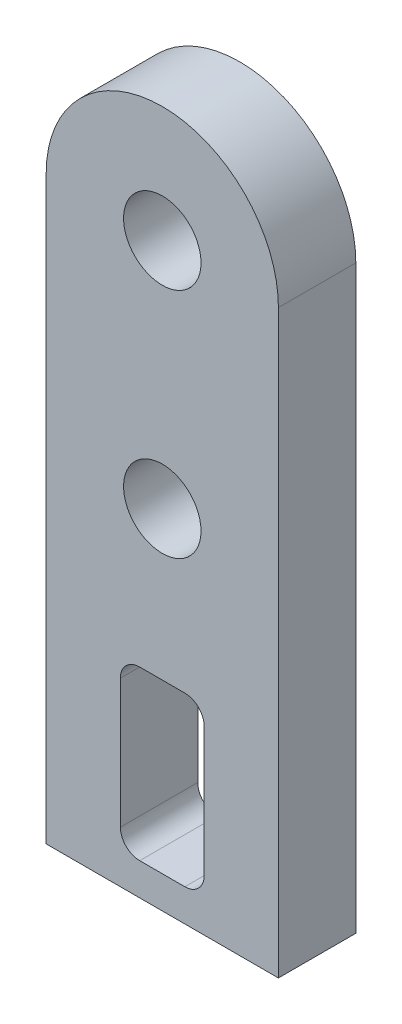
ISO-10303-21;
HEADER;
FILE_DESCRIPTION(('STEP AP214'),'2;1');
FILE_NAME('part.step','',(''),(''),'','','');
FILE_SCHEMA(('AUTOMOTIVE_DESIGN { 1 0 10303 214 1 1 1 1 }'));
ENDSEC;
DATA;
#1=APPLICATION_CONTEXT('core data for automotive mechanical design processes');
#2=APPLICATION_PROTOCOL_DEFINITION('international standard','automotive_design',2000,#1);
#3=PRODUCT_CONTEXT('',#1,'mechanical');
#4=PRODUCT('Part','Part','',(#3));
#5=PRODUCT_RELATED_PRODUCT_CATEGORY('part','',(#4));
#6=PRODUCT_DEFINITION_FORMATION('','',#4);
#7=PRODUCT_DEFINITION_CONTEXT('part definition',#1,'design');
#8=PRODUCT_DEFINITION('design','',#6,#7);
#9=PRODUCT_DEFINITION_SHAPE('','',#8);
#10=(LENGTH_UNIT() NAMED_UNIT(*) SI_UNIT(.MILLI.,.METRE.));
#11=(NAMED_UNIT(*) PLANE_ANGLE_UNIT() SI_UNIT($,.RADIAN.));
#12=(NAMED_UNIT(*) SI_UNIT($,.STERADIAN.) SOLID_ANGLE_UNIT());
#13=UNCERTAINTY_MEASURE_WITH_UNIT(LENGTH_MEASURE(1.E-05),#10,'distance_accuracy_value','');
#14=(GEOMETRIC_REPRESENTATION_CONTEXT(3) GLOBAL_UNCERTAINTY_ASSIGNED_CONTEXT((#13)) GLOBAL_UNIT_ASSIGNED_CONTEXT((#10,
#11,#12)) REPRESENTATION_CONTEXT('',''));
#15=CARTESIAN_POINT('',(0.,0.,0.));
#16=DIRECTION('',(0.,0.,1.));
#17=DIRECTION('',(1.,0.,0.));
#18=AXIS2_PLACEMENT_3D('',#15,#16,#17);
#19=CARTESIAN_POINT('',(207.4731699104,182.5565570417,3.));
#20=DIRECTION('',(0.,0.,1.));
#21=DIRECTION('',(1.,0.,0.));
#22=AXIS2_PLACEMENT_3D('',#19,#20,#21);
#23=PLANE('',#22);
#24=CARTESIAN_POINT('',(207.4731699104,182.5565570417,3.));
#25=DIRECTION('',(0.,0.,1.));
#26=DIRECTION('',(1.,0.,0.));
#27=AXIS2_PLACEMENT_3D('',#24,#25,#26);
#28=CIRCLE('',#27,1.5);
#29=CARTESIAN_POINT('',(208.9731699104,182.5565570417,3.));
#30=VERTEX_POINT('',#29);
#31=EDGE_CURVE('E187',#30,#30,#28,.T.);
#32=ORIENTED_EDGE('',*,*,#31,.F.);
#33=EDGE_LOOP('',(#32));
#34=FACE_BOUND('',#33,.T.);
#35=CARTESIAN_POINT('',(207.4731699104,182.5565570417,3.));
#36=DIRECTION('',(0.,0.,1.));
#37=DIRECTION('',(1.,0.,0.));
#38=AXIS2_PLACEMENT_3D('',#35,#36,#37);
#39=CIRCLE('',#38,4.49999999999999);
#40=CARTESIAN_POINT('',(211.9731699104,182.5565570417,3.));
#41=VERTEX_POINT('',#40);
#42=CARTESIAN_POINT('',(202.9731699104,182.5565570417,3.));
#43=VERTEX_POINT('',#42);
#44=EDGE_CURVE('E199',#41,#43,#39,.T.);
#45=ORIENTED_EDGE('',*,*,#44,.T.);
#46=DIRECTION('',(0.,-1.,0.));
#47=VECTOR('',#46,1.);
#48=CARTESIAN_POINT('',(202.9731699104,160.0565570417,3.));
#49=LINE('',#48,#47);
#50=CARTESIAN_POINT('',(202.9731699104,160.0565570417,3.));
#51=VERTEX_POINT('',#50);
#52=EDGE_CURVE('E202',#43,#51,#49,.T.);
#53=ORIENTED_EDGE('',*,*,#52,.T.);
#54=DIRECTION('',(1.,0.,0.));
#55=VECTOR('',#54,1.);
#56=CARTESIAN_POINT('',(211.9731699104,160.0565570417,3.));
#57=LINE('',#56,#55);
#58=CARTESIAN_POINT('',(211.9731699104,160.0565570417,3.));
#59=VERTEX_POINT('',#58);
#60=EDGE_CURVE('E205',#51,#59,#57,.T.);
#61=ORIENTED_EDGE('',*,*,#60,.T.);
#62=DIRECTION('',(0.,1.,0.));
#63=VECTOR('',#62,1.);
#64=CARTESIAN_POINT('',(211.9731699104,182.5565570417,3.));
#65=LINE('',#64,#63);
#66=EDGE_CURVE('E207',#59,#41,#65,.T.);
#67=ORIENTED_EDGE('',*,*,#66,.T.);
#68=EDGE_LOOP('',(#45,#53,#61,#67));
#69=FACE_BOUND('',#68,.T.);
#70=CARTESIAN_POINT('',(207.4731699104,173.5565570417,3.));
#71=DIRECTION('',(0.,0.,1.));
#72=DIRECTION('',(1.,0.,0.));
#73=AXIS2_PLACEMENT_3D('',#70,#71,#72);
#74=CIRCLE('',#73,1.5);
#75=CARTESIAN_POINT('',(208.9731699104,173.5565570417,3.));
#76=VERTEX_POINT('',#75);
#77=EDGE_CURVE('E193',#76,#76,#74,.T.);
#78=ORIENTED_EDGE('',*,*,#77,.F.);
#79=EDGE_LOOP('',(#78));
#80=FACE_BOUND('',#79,.T.);
#81=DIRECTION('',(0.,-1.,0.));
#82=VECTOR('',#81,1.);
#83=CARTESIAN_POINT('',(205.8481699104,162.0565570417,3.));
#84=LINE('',#83,#82);
#85=CARTESIAN_POINT('',(205.8481699104,167.0565570417,3.));
#86=VERTEX_POINT('',#85);
#87=CARTESIAN_POINT('',(205.8481699104,162.0565570417,3.));
#88=VERTEX_POINT('',#87);
#89=EDGE_CURVE('E130',#86,#88,#84,.T.);
#90=ORIENTED_EDGE('',*,*,#89,.F.);
#91=CARTESIAN_POINT('',(206.5981699104,167.0565570417,3.));
#92=DIRECTION('',(0.,0.,1.));
#93=DIRECTION('',(1.,0.,0.));
#94=AXIS2_PLACEMENT_3D('',#91,#92,#93);
#95=CIRCLE('',#94,0.750000000000001);
#96=CARTESIAN_POINT('',(206.5981699104,167.8065570417,3.));
#97=VERTEX_POINT('',#96);
#98=EDGE_CURVE('E122',#97,#86,#95,.T.);
#99=ORIENTED_EDGE('',*,*,#98,.F.);
#100=DIRECTION('',(-1.,0.,0.));
#101=VECTOR('',#100,1.);
#102=CARTESIAN_POINT('',(206.5981699104,167.8065570417,3.));
#103=LINE('',#102,#101);
#104=CARTESIAN_POINT('',(208.3481699104,167.8065570417,3.));
#105=VERTEX_POINT('',#104);
#106=EDGE_CURVE('E155',#105,#97,#103,.T.);
#107=ORIENTED_EDGE('',*,*,#106,.F.);
#108=CARTESIAN_POINT('',(208.3481699104,167.0565570417,3.));
#109=DIRECTION('',(0.,0.,1.));
#110=DIRECTION('',(1.,0.,0.));
#111=AXIS2_PLACEMENT_3D('',#108,#109,#110);
#112=CIRCLE('',#111,0.750000000000001);
#113=CARTESIAN_POINT('',(209.0981699104,167.0565570417,3.));
#114=VERTEX_POINT('',#113);
#115=EDGE_CURVE('E153',#114,#105,#112,.T.);
#116=ORIENTED_EDGE('',*,*,#115,.F.);
#117=DIRECTION('',(0.,1.,0.));
#118=VECTOR('',#117,1.);
#119=CARTESIAN_POINT('',(209.0981699104,167.0565570417,3.));
#120=LINE('',#119,#118);
#121=CARTESIAN_POINT('',(209.0981699104,162.0565570417,3.));
#122=VERTEX_POINT('',#121);
#123=EDGE_CURVE('E151',#122,#114,#120,.T.);
#124=ORIENTED_EDGE('',*,*,#123,.F.);
#125=CARTESIAN_POINT('',(208.3481699104,162.0565570417,3.));
#126=DIRECTION('',(0.,0.,1.));
#127=DIRECTION('',(1.,0.,0.));
#128=AXIS2_PLACEMENT_3D('',#125,#126,#127);
#129=CIRCLE('',#128,0.750000000000001);
#130=CARTESIAN_POINT('',(208.3481699104,161.3065570417,3.));
#131=VERTEX_POINT('',#130);
#132=EDGE_CURVE('E149',#131,#122,#129,.T.);
#133=ORIENTED_EDGE('',*,*,#132,.F.);
#134=DIRECTION('',(1.,0.,0.));
#135=VECTOR('',#134,1.);
#136=CARTESIAN_POINT('',(208.3481699104,161.3065570417,3.));
#137=LINE('',#136,#135);
#138=CARTESIAN_POINT('',(206.5981699104,161.3065570417,3.));
#139=VERTEX_POINT('',#138);
#140=EDGE_CURVE('E145',#139,#131,#137,.T.);
#141=ORIENTED_EDGE('',*,*,#140,.F.);
#142=CARTESIAN_POINT('',(206.5981699104,162.0565570417,3.));
#143=DIRECTION('',(0.,0.,1.));
#144=DIRECTION('',(1.,0.,0.));
#145=AXIS2_PLACEMENT_3D('',#142,#143,#144);
#146=CIRCLE('',#145,0.750000000000001);
#147=EDGE_CURVE('E143',#88,#139,#146,.T.);
#148=ORIENTED_EDGE('',*,*,#147,.F.);
#149=EDGE_LOOP('',(#90,#99,#107,#116,#124,#133,#141,#148));
#150=FACE_BOUND('',#149,.T.);
#151=ADVANCED_FACE('F33',(#34,#69,#80,#150),#23,.T.);
#152=CARTESIAN_POINT('',(207.4731699104,182.5565570417,0.));
#153=DIRECTION('',(0.,0.,1.));
#154=DIRECTION('',(1.,0.,0.));
#155=AXIS2_PLACEMENT_3D('',#152,#153,#154);
#156=PLANE('',#155);
#157=CARTESIAN_POINT('',(207.4731699104,182.5565570417,0.));
#158=DIRECTION('',(0.,0.,1.));
#159=DIRECTION('',(1.,0.,0.));
#160=AXIS2_PLACEMENT_3D('',#157,#158,#159);
#161=CIRCLE('',#160,1.5);
#162=CARTESIAN_POINT('',(208.9731699104,182.5565570417,0.));
#163=VERTEX_POINT('',#162);
#164=EDGE_CURVE('E138',#163,#163,#161,.T.);
#165=ORIENTED_EDGE('',*,*,#164,.T.);
#166=EDGE_LOOP('',(#165));
#167=FACE_BOUND('',#166,.T.);
#168=CARTESIAN_POINT('',(207.4731699104,182.5565570417,0.));
#169=DIRECTION('',(0.,0.,1.));
#170=DIRECTION('',(1.,0.,0.));
#171=AXIS2_PLACEMENT_3D('',#168,#169,#170);
#172=CIRCLE('',#171,4.49999999999999);
#173=CARTESIAN_POINT('',(211.9731699104,182.5565570417,0.));
#174=VERTEX_POINT('',#173);
#175=CARTESIAN_POINT('',(202.9731699104,182.5565570417,0.));
#176=VERTEX_POINT('',#175);
#177=EDGE_CURVE('E196',#174,#176,#172,.T.);
#178=ORIENTED_EDGE('',*,*,#177,.F.);
#179=DIRECTION('',(0.,1.,0.));
#180=VECTOR('',#179,1.);
#181=CARTESIAN_POINT('',(211.9731699104,182.5565570417,0.));
#182=LINE('',#181,#180);
#183=CARTESIAN_POINT('',(211.9731699104,160.0565570417,0.));
#184=VERTEX_POINT('',#183);
#185=EDGE_CURVE('E203',#184,#174,#182,.T.);
#186=ORIENTED_EDGE('',*,*,#185,.F.);
#187=DIRECTION('',(1.,0.,0.));
#188=VECTOR('',#187,1.);
#189=CARTESIAN_POINT('',(211.9731699104,160.0565570417,0.));
#190=LINE('',#189,#188);
#191=CARTESIAN_POINT('',(202.9731699104,160.0565570417,0.));
#192=VERTEX_POINT('',#191);
#193=EDGE_CURVE('E214',#192,#184,#190,.T.);
#194=ORIENTED_EDGE('',*,*,#193,.F.);
#195=DIRECTION('',(0.,-1.,0.));
#196=VECTOR('',#195,1.);
#197=CARTESIAN_POINT('',(202.9731699104,160.0565570417,0.));
#198=LINE('',#197,#196);
#199=EDGE_CURVE('E212',#176,#192,#198,.T.);
#200=ORIENTED_EDGE('',*,*,#199,.F.);
#201=EDGE_LOOP('',(#178,#186,#194,#200));
#202=FACE_BOUND('',#201,.T.);
#203=CARTESIAN_POINT('',(207.4731699104,173.5565570417,0.));
#204=DIRECTION('',(0.,0.,1.));
#205=DIRECTION('',(1.,0.,0.));
#206=AXIS2_PLACEMENT_3D('',#203,#204,#205);
#207=CIRCLE('',#206,1.5);
#208=CARTESIAN_POINT('',(208.9731699104,173.5565570417,0.));
#209=VERTEX_POINT('',#208);
#210=EDGE_CURVE('E190',#209,#209,#207,.T.);
#211=ORIENTED_EDGE('',*,*,#210,.T.);
#212=EDGE_LOOP('',(#211));
#213=FACE_BOUND('',#212,.T.);
#214=CARTESIAN_POINT('',(206.5981699104,167.0565570417,0.));
#215=DIRECTION('',(0.,0.,1.));
#216=DIRECTION('',(1.,0.,0.));
#217=AXIS2_PLACEMENT_3D('',#214,#215,#216);
#218=CIRCLE('',#217,0.750000000000001);
#219=CARTESIAN_POINT('',(206.5981699104,167.8065570417,0.));
#220=VERTEX_POINT('',#219);
#221=CARTESIAN_POINT('',(205.8481699104,167.0565570417,0.));
#222=VERTEX_POINT('',#221);
#223=EDGE_CURVE('E56',#220,#222,#218,.T.);
#224=ORIENTED_EDGE('',*,*,#223,.T.);
#225=DIRECTION('',(0.,-1.,0.));
#226=VECTOR('',#225,1.);
#227=CARTESIAN_POINT('',(205.8481699104,162.0565570417,0.));
#228=LINE('',#227,#226);
#229=CARTESIAN_POINT('',(205.8481699104,162.0565570417,0.));
#230=VERTEX_POINT('',#229);
#231=EDGE_CURVE('E137',#222,#230,#228,.T.);
#232=ORIENTED_EDGE('',*,*,#231,.T.);
#233=CARTESIAN_POINT('',(206.5981699104,162.0565570417,0.));
#234=DIRECTION('',(0.,0.,1.));
#235=DIRECTION('',(1.,0.,0.));
#236=AXIS2_PLACEMENT_3D('',#233,#234,#235);
#237=CIRCLE('',#236,0.750000000000001);
#238=CARTESIAN_POINT('',(206.5981699104,161.3065570417,0.));
#239=VERTEX_POINT('',#238);
#240=EDGE_CURVE('E159',#230,#239,#237,.T.);
#241=ORIENTED_EDGE('',*,*,#240,.T.);
#242=DIRECTION('',(1.,0.,0.));
#243=VECTOR('',#242,1.);
#244=CARTESIAN_POINT('',(208.3481699104,161.3065570417,0.));
#245=LINE('',#244,#243);
#246=CARTESIAN_POINT('',(208.3481699104,161.3065570417,0.));
#247=VERTEX_POINT('',#246);
#248=EDGE_CURVE('E162',#239,#247,#245,.T.);
#249=ORIENTED_EDGE('',*,*,#248,.T.);
#250=CARTESIAN_POINT('',(208.3481699104,162.0565570417,0.));
#251=DIRECTION('',(0.,0.,1.));
#252=DIRECTION('',(1.,0.,0.));
#253=AXIS2_PLACEMENT_3D('',#250,#251,#252);
#254=CIRCLE('',#253,0.750000000000001);
#255=CARTESIAN_POINT('',(209.0981699104,162.0565570417,0.));
#256=VERTEX_POINT('',#255);
#257=EDGE_CURVE('E165',#247,#256,#254,.T.);
#258=ORIENTED_EDGE('',*,*,#257,.T.);
#259=DIRECTION('',(0.,1.,0.));
#260=VECTOR('',#259,1.);
#261=CARTESIAN_POINT('',(209.0981699104,167.0565570417,0.));
#262=LINE('',#261,#260);
#263=CARTESIAN_POINT('',(209.0981699104,167.0565570417,0.));
#264=VERTEX_POINT('',#263);
#265=EDGE_CURVE('E168',#256,#264,#262,.T.);
#266=ORIENTED_EDGE('',*,*,#265,.T.);
#267=CARTESIAN_POINT('',(208.3481699104,167.0565570417,0.));
#268=DIRECTION('',(0.,0.,1.));
#269=DIRECTION('',(1.,0.,0.));
#270=AXIS2_PLACEMENT_3D('',#267,#268,#269);
#271=CIRCLE('',#270,0.750000000000001);
#272=CARTESIAN_POINT('',(208.3481699104,167.8065570417,0.));
#273=VERTEX_POINT('',#272);
#274=EDGE_CURVE('E171',#264,#273,#271,.T.);
#275=ORIENTED_EDGE('',*,*,#274,.T.);
#276=DIRECTION('',(-1.,0.,0.));
#277=VECTOR('',#276,1.);
#278=CARTESIAN_POINT('',(206.5981699104,167.8065570417,0.));
#279=LINE('',#278,#277);
#280=EDGE_CURVE('E131',#273,#220,#279,.T.);
#281=ORIENTED_EDGE('',*,*,#280,.T.);
#282=EDGE_LOOP('',(#224,#232,#241,#249,#258,#266,#275,#281));
#283=FACE_BOUND('',#282,.T.);
#284=ADVANCED_FACE('F232',(#167,#202,#213,#283),#156,.F.);
#285=CARTESIAN_POINT('',(207.4731699104,182.5565570417,3.));
#286=DIRECTION('',(0.,0.,-1.));
#287=DIRECTION('',(-1.,0.,0.));
#288=AXIS2_PLACEMENT_3D('',#285,#286,#287);
#289=CYLINDRICAL_SURFACE('',#288,4.49999999999999);
#290=ORIENTED_EDGE('',*,*,#177,.T.);
#291=DIRECTION('',(0.,0.,-1.));
#292=VECTOR('',#291,1.);
#293=CARTESIAN_POINT('',(202.9731699104,182.5565570417,3.));
#294=LINE('',#293,#292);
#295=EDGE_CURVE('E11',#43,#176,#294,.T.);
#296=ORIENTED_EDGE('',*,*,#295,.F.);
#297=ORIENTED_EDGE('',*,*,#44,.F.);
#298=DIRECTION('',(0.,0.,-1.));
#299=VECTOR('',#298,1.);
#300=CARTESIAN_POINT('',(211.9731699104,182.5565570417,3.));
#301=LINE('',#300,#299);
#302=EDGE_CURVE('E209',#41,#174,#301,.T.);
#303=ORIENTED_EDGE('',*,*,#302,.T.);
#304=EDGE_LOOP('',(#290,#296,#297,#303));
#305=FACE_BOUND('',#304,.T.);
#306=ADVANCED_FACE('F35',(#305),#289,.T.);
#307=CARTESIAN_POINT('',(202.9731699104,160.0565570417,3.));
#308=DIRECTION('',(1.,0.,0.));
#309=DIRECTION('',(0.,0.,-1.));
#310=AXIS2_PLACEMENT_3D('',#307,#308,#309);
#311=PLANE('',#310);
#312=ORIENTED_EDGE('',*,*,#199,.T.);
#313=DIRECTION('',(0.,0.,-1.));
#314=VECTOR('',#313,1.);
#315=CARTESIAN_POINT('',(202.9731699104,160.0565570417,3.));
#316=LINE('',#315,#314);
#317=EDGE_CURVE('E41',#51,#192,#316,.T.);
#318=ORIENTED_EDGE('',*,*,#317,.F.);
#319=ORIENTED_EDGE('',*,*,#52,.F.);
#320=ORIENTED_EDGE('',*,*,#295,.T.);
#321=EDGE_LOOP('',(#312,#318,#319,#320));
#322=FACE_BOUND('',#321,.T.);
#323=ADVANCED_FACE('F243',(#322),#311,.F.);
#324=CARTESIAN_POINT('',(211.9731699104,160.0565570417,3.));
#325=DIRECTION('',(0.,1.,0.));
#326=DIRECTION('',(0.,0.,1.));
#327=AXIS2_PLACEMENT_3D('',#324,#325,#326);
#328=PLANE('',#327);
#329=ORIENTED_EDGE('',*,*,#193,.T.);
#330=DIRECTION('',(0.,0.,-1.));
#331=VECTOR('',#330,1.);
#332=CARTESIAN_POINT('',(211.9731699104,160.0565570417,3.));
#333=LINE('',#332,#331);
#334=EDGE_CURVE('E219',#59,#184,#333,.T.);
#335=ORIENTED_EDGE('',*,*,#334,.F.);
#336=ORIENTED_EDGE('',*,*,#60,.F.);
#337=ORIENTED_EDGE('',*,*,#317,.T.);
#338=EDGE_LOOP('',(#329,#335,#336,#337));
#339=FACE_BOUND('',#338,.T.);
#340=ADVANCED_FACE('F226',(#339),#328,.F.);
#341=CARTESIAN_POINT('',(211.9731699104,182.5565570417,3.));
#342=DIRECTION('',(-1.,0.,0.));
#343=DIRECTION('',(0.,0.,1.));
#344=AXIS2_PLACEMENT_3D('',#341,#342,#343);
#345=PLANE('',#344);
#346=ORIENTED_EDGE('',*,*,#185,.T.);
#347=ORIENTED_EDGE('',*,*,#302,.F.);
#348=ORIENTED_EDGE('',*,*,#66,.F.);
#349=ORIENTED_EDGE('',*,*,#334,.T.);
#350=EDGE_LOOP('',(#346,#347,#348,#349));
#351=FACE_BOUND('',#350,.T.);
#352=ADVANCED_FACE('F236',(#351),#345,.F.);
#353=CARTESIAN_POINT('',(207.4731699104,173.5565570417,3.));
#354=DIRECTION('',(0.,0.,-1.));
#355=DIRECTION('',(-1.,0.,0.));
#356=AXIS2_PLACEMENT_3D('',#353,#354,#355);
#357=CYLINDRICAL_SURFACE('',#356,1.5);
#358=ORIENTED_EDGE('',*,*,#77,.T.);
#359=EDGE_LOOP('',(#358));
#360=FACE_BOUND('',#359,.T.);
#361=ORIENTED_EDGE('',*,*,#210,.F.);
#362=EDGE_LOOP('',(#361));
#363=FACE_BOUND('',#362,.T.);
#364=ADVANCED_FACE('F260',(#360,#363),#357,.F.);
#365=CARTESIAN_POINT('',(207.4731699104,182.5565570417,3.));
#366=DIRECTION('',(0.,0.,-1.));
#367=DIRECTION('',(-1.,0.,0.));
#368=AXIS2_PLACEMENT_3D('',#365,#366,#367);
#369=CYLINDRICAL_SURFACE('',#368,1.5);
#370=ORIENTED_EDGE('',*,*,#31,.T.);
#371=EDGE_LOOP('',(#370));
#372=FACE_BOUND('',#371,.T.);
#373=ORIENTED_EDGE('',*,*,#164,.F.);
#374=EDGE_LOOP('',(#373));
#375=FACE_BOUND('',#374,.T.);
#376=ADVANCED_FACE('F267',(#372,#375),#369,.F.);
#377=CARTESIAN_POINT('',(206.5981699104,167.0565570417,3.));
#378=DIRECTION('',(0.,0.,-1.));
#379=DIRECTION('',(-1.,0.,0.));
#380=AXIS2_PLACEMENT_3D('',#377,#378,#379);
#381=CYLINDRICAL_SURFACE('',#380,0.750000000000001);
#382=ORIENTED_EDGE('',*,*,#223,.F.);
#383=DIRECTION('',(0.,0.,-1.));
#384=VECTOR('',#383,1.);
#385=CARTESIAN_POINT('',(206.5981699104,167.8065570417,3.));
#386=LINE('',#385,#384);
#387=EDGE_CURVE('E126',#97,#220,#386,.T.);
#388=ORIENTED_EDGE('',*,*,#387,.F.);
#389=ORIENTED_EDGE('',*,*,#98,.T.);
#390=DIRECTION('',(0.,0.,-1.));
#391=VECTOR('',#390,1.);
#392=CARTESIAN_POINT('',(205.8481699104,167.0565570417,3.));
#393=LINE('',#392,#391);
#394=EDGE_CURVE('E125',#86,#222,#393,.T.);
#395=ORIENTED_EDGE('',*,*,#394,.T.);
#396=EDGE_LOOP('',(#382,#388,#389,#395));
#397=FACE_BOUND('',#396,.T.);
#398=ADVANCED_FACE('F124',(#397),#381,.F.);
#399=CARTESIAN_POINT('',(205.8481699104,162.0565570417,3.));
#400=DIRECTION('',(1.,0.,0.));
#401=DIRECTION('',(0.,0.,-1.));
#402=AXIS2_PLACEMENT_3D('',#399,#400,#401);
#403=PLANE('',#402);
#404=ORIENTED_EDGE('',*,*,#231,.F.);
#405=ORIENTED_EDGE('',*,*,#394,.F.);
#406=ORIENTED_EDGE('',*,*,#89,.T.);
#407=DIRECTION('',(0.,0.,-1.));
#408=VECTOR('',#407,1.);
#409=CARTESIAN_POINT('',(205.8481699104,162.0565570417,3.));
#410=LINE('',#409,#408);
#411=EDGE_CURVE('E139',#88,#230,#410,.T.);
#412=ORIENTED_EDGE('',*,*,#411,.T.);
#413=EDGE_LOOP('',(#404,#405,#406,#412));
#414=FACE_BOUND('',#413,.T.);
#415=ADVANCED_FACE('F134',(#414),#403,.T.);
#416=CARTESIAN_POINT('',(206.5981699104,162.0565570417,3.));
#417=DIRECTION('',(0.,0.,-1.));
#418=DIRECTION('',(-1.,0.,0.));
#419=AXIS2_PLACEMENT_3D('',#416,#417,#418);
#420=CYLINDRICAL_SURFACE('',#419,0.750000000000001);
#421=ORIENTED_EDGE('',*,*,#240,.F.);
#422=ORIENTED_EDGE('',*,*,#411,.F.);
#423=ORIENTED_EDGE('',*,*,#147,.T.);
#424=DIRECTION('',(0.,0.,-1.));
#425=VECTOR('',#424,1.);
#426=CARTESIAN_POINT('',(206.5981699104,161.3065570417,3.));
#427=LINE('',#426,#425);
#428=EDGE_CURVE('E184',#139,#239,#427,.T.);
#429=ORIENTED_EDGE('',*,*,#428,.T.);
#430=EDGE_LOOP('',(#421,#422,#423,#429));
#431=FACE_BOUND('',#430,.T.);
#432=ADVANCED_FACE('F299',(#431),#420,.F.);
#433=CARTESIAN_POINT('',(208.3481699104,161.3065570417,3.));
#434=DIRECTION('',(0.,1.,0.));
#435=DIRECTION('',(0.,0.,1.));
#436=AXIS2_PLACEMENT_3D('',#433,#434,#435);
#437=PLANE('',#436);
#438=ORIENTED_EDGE('',*,*,#248,.F.);
#439=ORIENTED_EDGE('',*,*,#428,.F.);
#440=ORIENTED_EDGE('',*,*,#140,.T.);
#441=DIRECTION('',(0.,0.,-1.));
#442=VECTOR('',#441,1.);
#443=CARTESIAN_POINT('',(208.3481699104,161.3065570417,3.));
#444=LINE('',#443,#442);
#445=EDGE_CURVE('E182',#131,#247,#444,.T.);
#446=ORIENTED_EDGE('',*,*,#445,.T.);
#447=EDGE_LOOP('',(#438,#439,#440,#446));
#448=FACE_BOUND('',#447,.T.);
#449=ADVANCED_FACE('F296',(#448),#437,.T.);
#450=CARTESIAN_POINT('',(208.3481699104,162.0565570417,3.));
#451=DIRECTION('',(0.,0.,-1.));
#452=DIRECTION('',(-1.,0.,0.));
#453=AXIS2_PLACEMENT_3D('',#450,#451,#452);
#454=CYLINDRICAL_SURFACE('',#453,0.750000000000001);
#455=ORIENTED_EDGE('',*,*,#257,.F.);
#456=ORIENTED_EDGE('',*,*,#445,.F.);
#457=ORIENTED_EDGE('',*,*,#132,.T.);
#458=DIRECTION('',(0.,0.,-1.));
#459=VECTOR('',#458,1.);
#460=CARTESIAN_POINT('',(209.0981699104,162.0565570417,3.));
#461=LINE('',#460,#459);
#462=EDGE_CURVE('E180',#122,#256,#461,.T.);
#463=ORIENTED_EDGE('',*,*,#462,.T.);
#464=EDGE_LOOP('',(#455,#456,#457,#463));
#465=FACE_BOUND('',#464,.T.);
#466=ADVANCED_FACE('F291',(#465),#454,.F.);
#467=CARTESIAN_POINT('',(209.0981699104,167.0565570417,3.));
#468=DIRECTION('',(-1.,0.,0.));
#469=DIRECTION('',(0.,0.,1.));
#470=AXIS2_PLACEMENT_3D('',#467,#468,#469);
#471=PLANE('',#470);
#472=ORIENTED_EDGE('',*,*,#265,.F.);
#473=ORIENTED_EDGE('',*,*,#462,.F.);
#474=ORIENTED_EDGE('',*,*,#123,.T.);
#475=DIRECTION('',(0.,0.,-1.));
#476=VECTOR('',#475,1.);
#477=CARTESIAN_POINT('',(209.0981699104,167.0565570417,3.));
#478=LINE('',#477,#476);
#479=EDGE_CURVE('E178',#114,#264,#478,.T.);
#480=ORIENTED_EDGE('',*,*,#479,.T.);
#481=EDGE_LOOP('',(#472,#473,#474,#480));
#482=FACE_BOUND('',#481,.T.);
#483=ADVANCED_FACE('F287',(#482),#471,.T.);
#484=CARTESIAN_POINT('',(208.3481699104,167.0565570417,3.));
#485=DIRECTION('',(0.,0.,-1.));
#486=DIRECTION('',(-1.,0.,0.));
#487=AXIS2_PLACEMENT_3D('',#484,#485,#486);
#488=CYLINDRICAL_SURFACE('',#487,0.750000000000001);
#489=ORIENTED_EDGE('',*,*,#274,.F.);
#490=ORIENTED_EDGE('',*,*,#479,.F.);
#491=ORIENTED_EDGE('',*,*,#115,.T.);
#492=DIRECTION('',(0.,0.,-1.));
#493=VECTOR('',#492,1.);
#494=CARTESIAN_POINT('',(208.3481699104,167.8065570417,3.));
#495=LINE('',#494,#493);
#496=EDGE_CURVE('E48',#105,#273,#495,.T.);
#497=ORIENTED_EDGE('',*,*,#496,.T.);
#498=EDGE_LOOP('',(#489,#490,#491,#497));
#499=FACE_BOUND('',#498,.T.);
#500=ADVANCED_FACE('F284',(#499),#488,.F.);
#501=CARTESIAN_POINT('',(206.5981699104,167.8065570417,3.));
#502=DIRECTION('',(0.,-1.,0.));
#503=DIRECTION('',(0.,0.,-1.));
#504=AXIS2_PLACEMENT_3D('',#501,#502,#503);
#505=PLANE('',#504);
#506=ORIENTED_EDGE('',*,*,#280,.F.);
#507=ORIENTED_EDGE('',*,*,#496,.F.);
#508=ORIENTED_EDGE('',*,*,#106,.T.);
#509=ORIENTED_EDGE('',*,*,#387,.T.);
#510=EDGE_LOOP('',(#506,#507,#508,#509));
#511=FACE_BOUND('',#510,.T.);
#512=ADVANCED_FACE('F278',(#511),#505,.T.);
#513=CLOSED_SHELL('',(#151,#284,#306,#323,#340,#352,#364,#376,#398,#415,#432,#449,#466,#483,
#500,#512));
#514=MANIFOLD_SOLID_BREP('B2',#513);
#515=ADVANCED_BREP_SHAPE_REPRESENTATION('',(#18,#514),#14);
#516=SHAPE_DEFINITION_REPRESENTATION(#9,#515);
ENDSEC;
END-ISO-10303-21;
